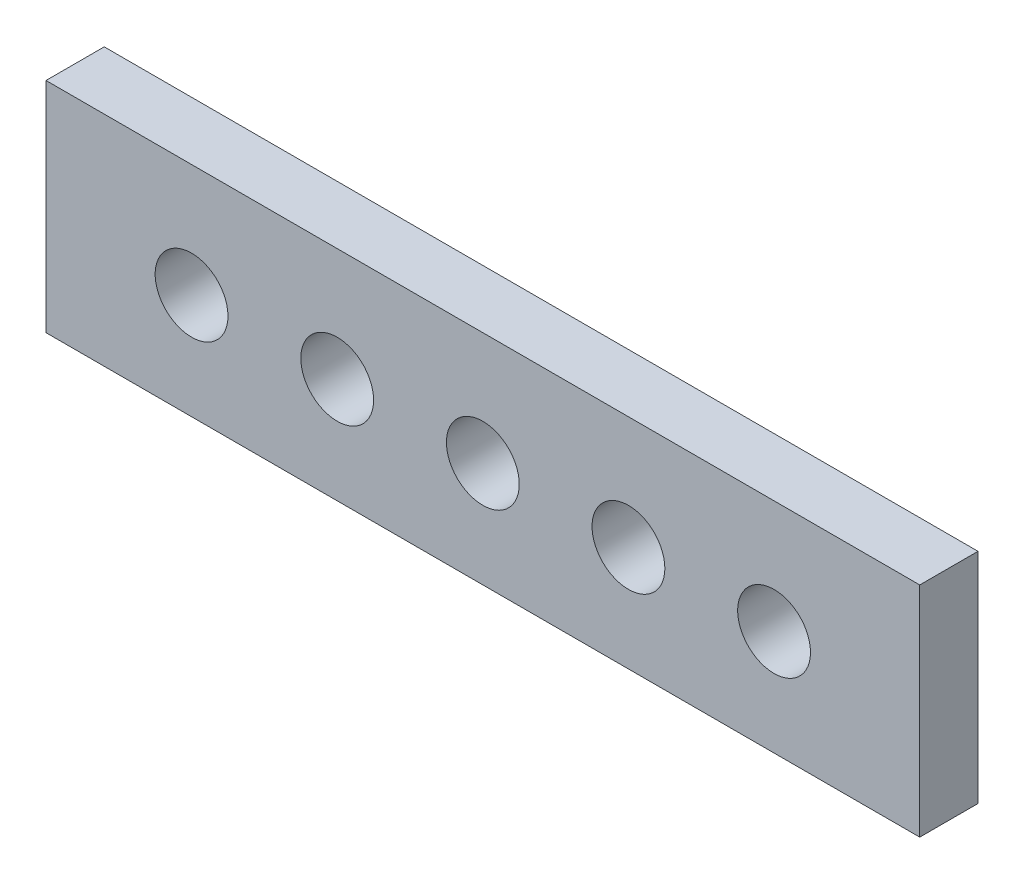
ISO-10303-21;
HEADER;
FILE_DESCRIPTION(('STEP AP214'),'2;1');
FILE_NAME('part.step','',(''),(''),'','','');
FILE_SCHEMA(('AUTOMOTIVE_DESIGN { 1 0 10303 214 1 1 1 1 }'));
ENDSEC;
DATA;
#1=APPLICATION_CONTEXT('core data for automotive mechanical design processes');
#2=APPLICATION_PROTOCOL_DEFINITION('international standard','automotive_design',2000,#1);
#3=PRODUCT_CONTEXT('',#1,'mechanical');
#4=PRODUCT('Part','Part','',(#3));
#5=PRODUCT_RELATED_PRODUCT_CATEGORY('part','',(#4));
#6=PRODUCT_DEFINITION_FORMATION('','',#4);
#7=PRODUCT_DEFINITION_CONTEXT('part definition',#1,'design');
#8=PRODUCT_DEFINITION('design','',#6,#7);
#9=PRODUCT_DEFINITION_SHAPE('','',#8);
#10=(LENGTH_UNIT() NAMED_UNIT(*) SI_UNIT(.MILLI.,.METRE.));
#11=(NAMED_UNIT(*) PLANE_ANGLE_UNIT() SI_UNIT($,.RADIAN.));
#12=(NAMED_UNIT(*) SI_UNIT($,.STERADIAN.) SOLID_ANGLE_UNIT());
#13=UNCERTAINTY_MEASURE_WITH_UNIT(LENGTH_MEASURE(1.E-05),#10,'distance_accuracy_value','');
#14=(GEOMETRIC_REPRESENTATION_CONTEXT(3) GLOBAL_UNCERTAINTY_ASSIGNED_CONTEXT((#13)) GLOBAL_UNIT_ASSIGNED_CONTEXT((#10,
#11,#12)) REPRESENTATION_CONTEXT('',''));
#15=CARTESIAN_POINT('',(0.,0.,0.));
#16=DIRECTION('',(0.,0.,1.));
#17=DIRECTION('',(1.,0.,0.));
#18=AXIS2_PLACEMENT_3D('',#15,#16,#17);
#19=CARTESIAN_POINT('',(0.,0.,10.16));
#20=DIRECTION('',(0.,0.,1.));
#21=DIRECTION('',(1.,0.,0.));
#22=AXIS2_PLACEMENT_3D('',#19,#20,#21);
#23=PLANE('',#22);
#24=CARTESIAN_POINT('',(57.8967942767952,0.451911108081535,10.16));
#25=DIRECTION('',(0.,0.,1.));
#26=DIRECTION('',(1.,0.,0.));
#27=AXIS2_PLACEMENT_3D('',#24,#25,#26);
#28=CIRCLE('',#27,6.35);
#29=CARTESIAN_POINT('',(64.2467942767952,0.451911108081535,10.16));
#30=VERTEX_POINT('',#29);
#31=EDGE_CURVE('E127',#30,#30,#28,.T.);
#32=ORIENTED_EDGE('',*,*,#31,.F.);
#33=EDGE_LOOP('',(#32));
#34=FACE_BOUND('',#33,.T.);
#35=CARTESIAN_POINT('',(32.4967942767952,0.451911108081535,10.16));
#36=DIRECTION('',(0.,0.,1.));
#37=DIRECTION('',(1.,0.,0.));
#38=AXIS2_PLACEMENT_3D('',#35,#36,#37);
#39=CIRCLE('',#38,6.35);
#40=CARTESIAN_POINT('',(38.8467942767953,0.451911108081535,10.16));
#41=VERTEX_POINT('',#40);
#42=EDGE_CURVE('E115',#41,#41,#39,.T.);
#43=ORIENTED_EDGE('',*,*,#42,.F.);
#44=EDGE_LOOP('',(#43));
#45=FACE_BOUND('',#44,.T.);
#46=DIRECTION('',(0.,-1.,0.));
#47=VECTOR('',#46,1.);
#48=CARTESIAN_POINT('',(-43.6940476190476,20.1839285714286,10.16));
#49=LINE('',#48,#47);
#50=CARTESIAN_POINT('',(-43.6940476190476,20.1839285714286,10.16));
#51=VERTEX_POINT('',#50);
#52=CARTESIAN_POINT('',(-43.6940476190476,-17.9160714285714,10.16));
#53=VERTEX_POINT('',#52);
#54=EDGE_CURVE('E85',#51,#53,#49,.T.);
#55=ORIENTED_EDGE('',*,*,#54,.T.);
#56=DIRECTION('',(1.,0.,0.));
#57=VECTOR('',#56,1.);
#58=CARTESIAN_POINT('',(-43.6940476190476,-17.9160714285714,10.16));
#59=LINE('',#58,#57);
#60=CARTESIAN_POINT('',(108.705952380952,-17.9160714285714,10.16));
#61=VERTEX_POINT('',#60);
#62=EDGE_CURVE('E80',#53,#61,#59,.T.);
#63=ORIENTED_EDGE('',*,*,#62,.T.);
#64=DIRECTION('',(0.,1.,0.));
#65=VECTOR('',#64,1.);
#66=CARTESIAN_POINT('',(108.705952380952,20.1839285714286,10.16));
#67=LINE('',#66,#65);
#68=CARTESIAN_POINT('',(108.705952380952,20.1839285714286,10.16));
#69=VERTEX_POINT('',#68);
#70=EDGE_CURVE('E83',#61,#69,#67,.T.);
#71=ORIENTED_EDGE('',*,*,#70,.T.);
#72=DIRECTION('',(-1.,0.,0.));
#73=VECTOR('',#72,1.);
#74=CARTESIAN_POINT('',(-43.6940476190476,20.1839285714286,10.16));
#75=LINE('',#74,#73);
#76=EDGE_CURVE('E50',#69,#51,#75,.T.);
#77=ORIENTED_EDGE('',*,*,#76,.T.);
#78=EDGE_LOOP('',(#55,#63,#71,#77));
#79=FACE_BOUND('',#78,.T.);
#80=CARTESIAN_POINT('',(-18.3032057232048,0.451911108081535,10.16));
#81=DIRECTION('',(0.,0.,1.));
#82=DIRECTION('',(1.,0.,0.));
#83=AXIS2_PLACEMENT_3D('',#80,#81,#82);
#84=CIRCLE('',#83,6.35000000000001);
#85=CARTESIAN_POINT('',(-11.9532057232048,0.451911108081535,10.16));
#86=VERTEX_POINT('',#85);
#87=EDGE_CURVE('E100',#86,#86,#84,.T.);
#88=ORIENTED_EDGE('',*,*,#87,.F.);
#89=EDGE_LOOP('',(#88));
#90=FACE_BOUND('',#89,.T.);
#91=CARTESIAN_POINT('',(7.09679427679524,0.451911108081535,10.16));
#92=DIRECTION('',(0.,0.,1.));
#93=DIRECTION('',(1.,0.,0.));
#94=AXIS2_PLACEMENT_3D('',#91,#92,#93);
#95=CIRCLE('',#94,6.35);
#96=CARTESIAN_POINT('',(13.4467942767952,0.451911108081535,10.16));
#97=VERTEX_POINT('',#96);
#98=EDGE_CURVE('E121',#97,#97,#95,.T.);
#99=ORIENTED_EDGE('',*,*,#98,.F.);
#100=EDGE_LOOP('',(#99));
#101=FACE_BOUND('',#100,.T.);
#102=CARTESIAN_POINT('',(83.2967942767952,0.451911108081535,10.16));
#103=DIRECTION('',(0.,0.,1.));
#104=DIRECTION('',(1.,0.,0.));
#105=AXIS2_PLACEMENT_3D('',#102,#103,#104);
#106=CIRCLE('',#105,6.35);
#107=CARTESIAN_POINT('',(89.6467942767952,0.451911108081535,10.16));
#108=VERTEX_POINT('',#107);
#109=EDGE_CURVE('E133',#108,#108,#106,.T.);
#110=ORIENTED_EDGE('',*,*,#109,.F.);
#111=EDGE_LOOP('',(#110));
#112=FACE_BOUND('',#111,.T.);
#113=ADVANCED_FACE('F33',(#34,#45,#79,#90,#101,#112),#23,.T.);
#114=CARTESIAN_POINT('',(0.,0.,0.));
#115=DIRECTION('',(0.,0.,1.));
#116=DIRECTION('',(1.,0.,0.));
#117=AXIS2_PLACEMENT_3D('',#114,#115,#116);
#118=PLANE('',#117);
#119=DIRECTION('',(0.,-1.,0.));
#120=VECTOR('',#119,1.);
#121=CARTESIAN_POINT('',(-43.6940476190476,20.1839285714286,0.));
#122=LINE('',#121,#120);
#123=CARTESIAN_POINT('',(-43.6940476190476,20.1839285714286,0.));
#124=VERTEX_POINT('',#123);
#125=CARTESIAN_POINT('',(-43.6940476190476,-17.9160714285714,0.));
#126=VERTEX_POINT('',#125);
#127=EDGE_CURVE('E97',#124,#126,#122,.T.);
#128=ORIENTED_EDGE('',*,*,#127,.F.);
#129=DIRECTION('',(-1.,0.,0.));
#130=VECTOR('',#129,1.);
#131=CARTESIAN_POINT('',(-43.6940476190476,20.1839285714286,0.));
#132=LINE('',#131,#130);
#133=CARTESIAN_POINT('',(108.705952380952,20.1839285714286,0.));
#134=VERTEX_POINT('',#133);
#135=EDGE_CURVE('E73',#134,#124,#132,.T.);
#136=ORIENTED_EDGE('',*,*,#135,.F.);
#137=DIRECTION('',(0.,1.,0.));
#138=VECTOR('',#137,1.);
#139=CARTESIAN_POINT('',(108.705952380952,20.1839285714286,0.));
#140=LINE('',#139,#138);
#141=CARTESIAN_POINT('',(108.705952380952,-17.9160714285714,0.));
#142=VERTEX_POINT('',#141);
#143=EDGE_CURVE('E67',#142,#134,#140,.T.);
#144=ORIENTED_EDGE('',*,*,#143,.F.);
#145=DIRECTION('',(1.,0.,0.));
#146=VECTOR('',#145,1.);
#147=CARTESIAN_POINT('',(-43.6940476190476,-17.9160714285714,0.));
#148=LINE('',#147,#146);
#149=EDGE_CURVE('E89',#126,#142,#148,.T.);
#150=ORIENTED_EDGE('',*,*,#149,.F.);
#151=EDGE_LOOP('',(#128,#136,#144,#150));
#152=FACE_BOUND('',#151,.T.);
#153=CARTESIAN_POINT('',(-18.3032057232048,0.451911108081535,0.));
#154=DIRECTION('',(0.,0.,1.));
#155=DIRECTION('',(1.,0.,0.));
#156=AXIS2_PLACEMENT_3D('',#153,#154,#155);
#157=CIRCLE('',#156,6.35000000000001);
#158=CARTESIAN_POINT('',(-11.9532057232048,0.451911108081535,0.));
#159=VERTEX_POINT('',#158);
#160=EDGE_CURVE('E112',#159,#159,#157,.T.);
#161=ORIENTED_EDGE('',*,*,#160,.T.);
#162=EDGE_LOOP('',(#161));
#163=FACE_BOUND('',#162,.T.);
#164=CARTESIAN_POINT('',(32.4967942767952,0.451911108081535,0.));
#165=DIRECTION('',(0.,0.,1.));
#166=DIRECTION('',(1.,0.,0.));
#167=AXIS2_PLACEMENT_3D('',#164,#165,#166);
#168=CIRCLE('',#167,6.35);
#169=CARTESIAN_POINT('',(38.8467942767953,0.451911108081535,0.));
#170=VERTEX_POINT('',#169);
#171=EDGE_CURVE('E118',#170,#170,#168,.T.);
#172=ORIENTED_EDGE('',*,*,#171,.T.);
#173=EDGE_LOOP('',(#172));
#174=FACE_BOUND('',#173,.T.);
#175=CARTESIAN_POINT('',(7.09679427679524,0.451911108081535,0.));
#176=DIRECTION('',(0.,0.,1.));
#177=DIRECTION('',(1.,0.,0.));
#178=AXIS2_PLACEMENT_3D('',#175,#176,#177);
#179=CIRCLE('',#178,6.35);
#180=CARTESIAN_POINT('',(13.4467942767952,0.451911108081535,0.));
#181=VERTEX_POINT('',#180);
#182=EDGE_CURVE('E124',#181,#181,#179,.T.);
#183=ORIENTED_EDGE('',*,*,#182,.T.);
#184=EDGE_LOOP('',(#183));
#185=FACE_BOUND('',#184,.T.);
#186=CARTESIAN_POINT('',(57.8967942767952,0.451911108081535,0.));
#187=DIRECTION('',(0.,0.,1.));
#188=DIRECTION('',(1.,0.,0.));
#189=AXIS2_PLACEMENT_3D('',#186,#187,#188);
#190=CIRCLE('',#189,6.35);
#191=CARTESIAN_POINT('',(64.2467942767952,0.451911108081535,0.));
#192=VERTEX_POINT('',#191);
#193=EDGE_CURVE('E130',#192,#192,#190,.T.);
#194=ORIENTED_EDGE('',*,*,#193,.T.);
#195=EDGE_LOOP('',(#194));
#196=FACE_BOUND('',#195,.T.);
#197=CARTESIAN_POINT('',(83.2967942767952,0.451911108081535,0.));
#198=DIRECTION('',(0.,0.,1.));
#199=DIRECTION('',(1.,0.,0.));
#200=AXIS2_PLACEMENT_3D('',#197,#198,#199);
#201=CIRCLE('',#200,6.35);
#202=CARTESIAN_POINT('',(89.6467942767952,0.451911108081535,0.));
#203=VERTEX_POINT('',#202);
#204=EDGE_CURVE('E136',#203,#203,#201,.T.);
#205=ORIENTED_EDGE('',*,*,#204,.T.);
#206=EDGE_LOOP('',(#205));
#207=FACE_BOUND('',#206,.T.);
#208=ADVANCED_FACE('F108',(#152,#163,#174,#185,#196,#207),#118,.F.);
#209=CARTESIAN_POINT('',(-43.6940476190476,20.1839285714286,10.16));
#210=DIRECTION('',(1.,0.,0.));
#211=DIRECTION('',(0.,0.,-1.));
#212=AXIS2_PLACEMENT_3D('',#209,#210,#211);
#213=PLANE('',#212);
#214=ORIENTED_EDGE('',*,*,#127,.T.);
#215=DIRECTION('',(0.,0.,-1.));
#216=VECTOR('',#215,1.);
#217=CARTESIAN_POINT('',(-43.6940476190476,-17.9160714285714,10.16));
#218=LINE('',#217,#216);
#219=EDGE_CURVE('E11',#53,#126,#218,.T.);
#220=ORIENTED_EDGE('',*,*,#219,.F.);
#221=ORIENTED_EDGE('',*,*,#54,.F.);
#222=DIRECTION('',(0.,0.,-1.));
#223=VECTOR('',#222,1.);
#224=CARTESIAN_POINT('',(-43.6940476190476,20.1839285714286,10.16));
#225=LINE('',#224,#223);
#226=EDGE_CURVE('E93',#51,#124,#225,.T.);
#227=ORIENTED_EDGE('',*,*,#226,.T.);
#228=EDGE_LOOP('',(#214,#220,#221,#227));
#229=FACE_BOUND('',#228,.T.);
#230=ADVANCED_FACE('F35',(#229),#213,.F.);
#231=CARTESIAN_POINT('',(-43.6940476190476,-17.9160714285714,10.16));
#232=DIRECTION('',(0.,1.,0.));
#233=DIRECTION('',(-1.,0.,0.));
#234=AXIS2_PLACEMENT_3D('',#231,#232,#233);
#235=PLANE('',#234);
#236=ORIENTED_EDGE('',*,*,#149,.T.);
#237=DIRECTION('',(0.,0.,-1.));
#238=VECTOR('',#237,1.);
#239=CARTESIAN_POINT('',(108.705952380952,-17.9160714285714,10.16));
#240=LINE('',#239,#238);
#241=EDGE_CURVE('E42',#61,#142,#240,.T.);
#242=ORIENTED_EDGE('',*,*,#241,.F.);
#243=ORIENTED_EDGE('',*,*,#62,.F.);
#244=ORIENTED_EDGE('',*,*,#219,.T.);
#245=EDGE_LOOP('',(#236,#242,#243,#244));
#246=FACE_BOUND('',#245,.T.);
#247=ADVANCED_FACE('F88',(#246),#235,.F.);
#248=CARTESIAN_POINT('',(108.705952380952,20.1839285714286,10.16));
#249=DIRECTION('',(-1.,0.,0.));
#250=DIRECTION('',(0.,0.,1.));
#251=AXIS2_PLACEMENT_3D('',#248,#249,#250);
#252=PLANE('',#251);
#253=ORIENTED_EDGE('',*,*,#143,.T.);
#254=DIRECTION('',(0.,0.,-1.));
#255=VECTOR('',#254,1.);
#256=CARTESIAN_POINT('',(108.705952380952,20.1839285714286,10.16));
#257=LINE('',#256,#255);
#258=EDGE_CURVE('E90',#69,#134,#257,.T.);
#259=ORIENTED_EDGE('',*,*,#258,.F.);
#260=ORIENTED_EDGE('',*,*,#70,.F.);
#261=ORIENTED_EDGE('',*,*,#241,.T.);
#262=EDGE_LOOP('',(#253,#259,#260,#261));
#263=FACE_BOUND('',#262,.T.);
#264=ADVANCED_FACE('F91',(#263),#252,.F.);
#265=CARTESIAN_POINT('',(-43.6940476190476,20.1839285714286,10.16));
#266=DIRECTION('',(0.,-1.,0.));
#267=DIRECTION('',(0.,0.,-1.));
#268=AXIS2_PLACEMENT_3D('',#265,#266,#267);
#269=PLANE('',#268);
#270=ORIENTED_EDGE('',*,*,#135,.T.);
#271=ORIENTED_EDGE('',*,*,#226,.F.);
#272=ORIENTED_EDGE('',*,*,#76,.F.);
#273=ORIENTED_EDGE('',*,*,#258,.T.);
#274=EDGE_LOOP('',(#270,#271,#272,#273));
#275=FACE_BOUND('',#274,.T.);
#276=ADVANCED_FACE('F105',(#275),#269,.F.);
#277=CARTESIAN_POINT('',(-18.3032057232048,0.451911108081535,10.16));
#278=DIRECTION('',(0.,0.,-1.));
#279=DIRECTION('',(-1.,0.,0.));
#280=AXIS2_PLACEMENT_3D('',#277,#278,#279);
#281=CYLINDRICAL_SURFACE('',#280,6.35000000000001);
#282=ORIENTED_EDGE('',*,*,#87,.T.);
#283=EDGE_LOOP('',(#282));
#284=FACE_BOUND('',#283,.T.);
#285=ORIENTED_EDGE('',*,*,#160,.F.);
#286=EDGE_LOOP('',(#285));
#287=FACE_BOUND('',#286,.T.);
#288=ADVANCED_FACE('F155',(#284,#287),#281,.F.);
#289=CARTESIAN_POINT('',(32.4967942767952,0.451911108081535,10.16));
#290=DIRECTION('',(0.,0.,-1.));
#291=DIRECTION('',(-1.,0.,0.));
#292=AXIS2_PLACEMENT_3D('',#289,#290,#291);
#293=CYLINDRICAL_SURFACE('',#292,6.35);
#294=ORIENTED_EDGE('',*,*,#42,.T.);
#295=EDGE_LOOP('',(#294));
#296=FACE_BOUND('',#295,.T.);
#297=ORIENTED_EDGE('',*,*,#171,.F.);
#298=EDGE_LOOP('',(#297));
#299=FACE_BOUND('',#298,.T.);
#300=ADVANCED_FACE('F201',(#296,#299),#293,.F.);
#301=CARTESIAN_POINT('',(7.09679427679524,0.451911108081535,10.16));
#302=DIRECTION('',(0.,0.,-1.));
#303=DIRECTION('',(-1.,0.,0.));
#304=AXIS2_PLACEMENT_3D('',#301,#302,#303);
#305=CYLINDRICAL_SURFACE('',#304,6.35);
#306=ORIENTED_EDGE('',*,*,#98,.T.);
#307=EDGE_LOOP('',(#306));
#308=FACE_BOUND('',#307,.T.);
#309=ORIENTED_EDGE('',*,*,#182,.F.);
#310=EDGE_LOOP('',(#309));
#311=FACE_BOUND('',#310,.T.);
#312=ADVANCED_FACE('F209',(#308,#311),#305,.F.);
#313=CARTESIAN_POINT('',(57.8967942767952,0.451911108081535,10.16));
#314=DIRECTION('',(0.,0.,-1.));
#315=DIRECTION('',(-1.,0.,0.));
#316=AXIS2_PLACEMENT_3D('',#313,#314,#315);
#317=CYLINDRICAL_SURFACE('',#316,6.35);
#318=ORIENTED_EDGE('',*,*,#31,.T.);
#319=EDGE_LOOP('',(#318));
#320=FACE_BOUND('',#319,.T.);
#321=ORIENTED_EDGE('',*,*,#193,.F.);
#322=EDGE_LOOP('',(#321));
#323=FACE_BOUND('',#322,.T.);
#324=ADVANCED_FACE('F217',(#320,#323),#317,.F.);
#325=CARTESIAN_POINT('',(83.2967942767952,0.451911108081535,10.16));
#326=DIRECTION('',(0.,0.,-1.));
#327=DIRECTION('',(-1.,0.,0.));
#328=AXIS2_PLACEMENT_3D('',#325,#326,#327);
#329=CYLINDRICAL_SURFACE('',#328,6.35);
#330=ORIENTED_EDGE('',*,*,#109,.T.);
#331=EDGE_LOOP('',(#330));
#332=FACE_BOUND('',#331,.T.);
#333=ORIENTED_EDGE('',*,*,#204,.F.);
#334=EDGE_LOOP('',(#333));
#335=FACE_BOUND('',#334,.T.);
#336=ADVANCED_FACE('F142',(#332,#335),#329,.F.);
#337=CLOSED_SHELL('',(#113,#208,#230,#247,#264,#276,#288,#300,#312,#324,#336));
#338=MANIFOLD_SOLID_BREP('B2',#337);
#339=ADVANCED_BREP_SHAPE_REPRESENTATION('',(#18,#338),#14);
#340=SHAPE_DEFINITION_REPRESENTATION(#9,#339);
ENDSEC;
END-ISO-10303-21;
